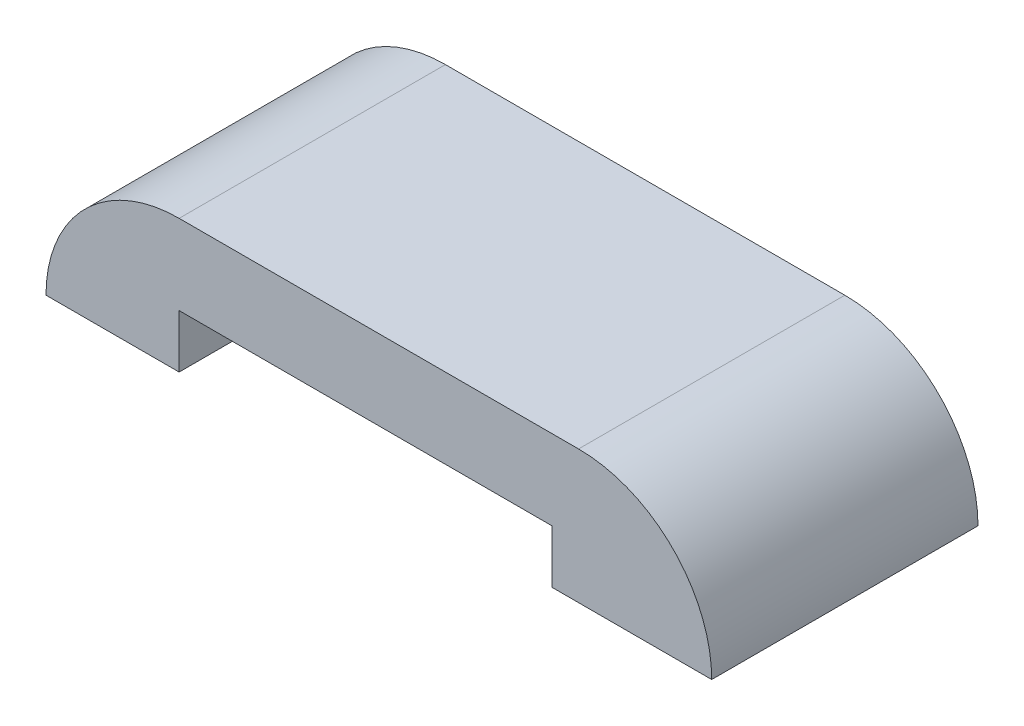
ISO-10303-21;
HEADER;
FILE_DESCRIPTION(('STEP AP214'),'2;1');
FILE_NAME('part.step','',(''),(''),'','','');
FILE_SCHEMA(('AUTOMOTIVE_DESIGN { 1 0 10303 214 1 1 1 1 }'));
ENDSEC;
DATA;
#1=APPLICATION_CONTEXT('core data for automotive mechanical design processes');
#2=APPLICATION_PROTOCOL_DEFINITION('international standard','automotive_design',2000,#1);
#3=PRODUCT_CONTEXT('',#1,'mechanical');
#4=PRODUCT('Part','Part','',(#3));
#5=PRODUCT_RELATED_PRODUCT_CATEGORY('part','',(#4));
#6=PRODUCT_DEFINITION_FORMATION('','',#4);
#7=PRODUCT_DEFINITION_CONTEXT('part definition',#1,'design');
#8=PRODUCT_DEFINITION('design','',#6,#7);
#9=PRODUCT_DEFINITION_SHAPE('','',#8);
#10=(LENGTH_UNIT() NAMED_UNIT(*) SI_UNIT(.MILLI.,.METRE.));
#11=(NAMED_UNIT(*) PLANE_ANGLE_UNIT() SI_UNIT($,.RADIAN.));
#12=(NAMED_UNIT(*) SI_UNIT($,.STERADIAN.) SOLID_ANGLE_UNIT());
#13=UNCERTAINTY_MEASURE_WITH_UNIT(LENGTH_MEASURE(1.E-05),#10,'distance_accuracy_value','');
#14=(GEOMETRIC_REPRESENTATION_CONTEXT(3) GLOBAL_UNCERTAINTY_ASSIGNED_CONTEXT((#13)) GLOBAL_UNIT_ASSIGNED_CONTEXT((#10,
#11,#12)) REPRESENTATION_CONTEXT('',''));
#15=CARTESIAN_POINT('',(0.,0.,0.));
#16=DIRECTION('',(0.,0.,1.));
#17=DIRECTION('',(1.,0.,0.));
#18=AXIS2_PLACEMENT_3D('',#15,#16,#17);
#19=CARTESIAN_POINT('',(20.,0.,10.));
#20=DIRECTION('',(0.,0.,1.));
#21=DIRECTION('',(1.,0.,0.));
#22=AXIS2_PLACEMENT_3D('',#19,#20,#21);
#23=CYLINDRICAL_SURFACE('',#22,5.);
#24=DIRECTION('',(0.,0.,-1.));
#25=VECTOR('',#24,1.);
#26=CARTESIAN_POINT('',(25.,0.,10.));
#27=LINE('',#26,#25);
#28=CARTESIAN_POINT('',(25.,0.,10.));
#29=VERTEX_POINT('',#28);
#30=CARTESIAN_POINT('',(25.,0.,0.));
#31=VERTEX_POINT('',#30);
#32=EDGE_CURVE('E142',#29,#31,#27,.T.);
#33=ORIENTED_EDGE('',*,*,#32,.T.);
#34=CARTESIAN_POINT('',(20.,0.,0.));
#35=DIRECTION('',(0.,0.,-1.));
#36=DIRECTION('',(-1.,0.,0.));
#37=AXIS2_PLACEMENT_3D('',#34,#35,#36);
#38=CIRCLE('',#37,5.);
#39=CARTESIAN_POINT('',(20.,5.,0.));
#40=VERTEX_POINT('',#39);
#41=EDGE_CURVE('E39',#40,#31,#38,.T.);
#42=ORIENTED_EDGE('',*,*,#41,.F.);
#43=DIRECTION('',(0.,0.,1.));
#44=VECTOR('',#43,1.);
#45=CARTESIAN_POINT('',(20.,5.,10.));
#46=LINE('',#45,#44);
#47=CARTESIAN_POINT('',(20.,5.,10.));
#48=VERTEX_POINT('',#47);
#49=EDGE_CURVE('E129',#48,#40,#46,.F.);
#50=ORIENTED_EDGE('',*,*,#49,.F.);
#51=CARTESIAN_POINT('',(20.,0.,10.));
#52=DIRECTION('',(0.,0.,-1.));
#53=DIRECTION('',(-1.,0.,0.));
#54=AXIS2_PLACEMENT_3D('',#51,#52,#53);
#55=CIRCLE('',#54,5.);
#56=EDGE_CURVE('E11',#29,#48,#55,.F.);
#57=ORIENTED_EDGE('',*,*,#56,.F.);
#58=EDGE_LOOP('',(#33,#42,#50,#57));
#59=FACE_BOUND('',#58,.T.);
#60=ADVANCED_FACE('F32',(#59),#23,.T.);
#61=CARTESIAN_POINT('',(5.,0.,10.));
#62=DIRECTION('',(0.,0.,-1.));
#63=DIRECTION('',(-1.,0.,0.));
#64=AXIS2_PLACEMENT_3D('',#61,#62,#63);
#65=CYLINDRICAL_SURFACE('',#64,5.);
#66=DIRECTION('',(0.,0.,-1.));
#67=VECTOR('',#66,1.);
#68=CARTESIAN_POINT('',(0.,0.,10.));
#69=LINE('',#68,#67);
#70=CARTESIAN_POINT('',(0.,0.,10.));
#71=VERTEX_POINT('',#70);
#72=CARTESIAN_POINT('',(0.,0.,0.));
#73=VERTEX_POINT('',#72);
#74=EDGE_CURVE('E147',#71,#73,#69,.T.);
#75=ORIENTED_EDGE('',*,*,#74,.F.);
#76=CARTESIAN_POINT('',(5.,0.,10.));
#77=DIRECTION('',(0.,0.,-1.));
#78=DIRECTION('',(-1.,0.,0.));
#79=AXIS2_PLACEMENT_3D('',#76,#77,#78);
#80=CIRCLE('',#79,5.);
#81=CARTESIAN_POINT('',(5.,5.,10.));
#82=VERTEX_POINT('',#81);
#83=EDGE_CURVE('E108',#82,#71,#80,.F.);
#84=ORIENTED_EDGE('',*,*,#83,.F.);
#85=DIRECTION('',(0.,0.,-1.));
#86=VECTOR('',#85,1.);
#87=CARTESIAN_POINT('',(5.,5.,10.));
#88=LINE('',#87,#86);
#89=CARTESIAN_POINT('',(5.,5.,0.));
#90=VERTEX_POINT('',#89);
#91=EDGE_CURVE('E117',#90,#82,#88,.F.);
#92=ORIENTED_EDGE('',*,*,#91,.F.);
#93=CARTESIAN_POINT('',(5.,0.,0.));
#94=DIRECTION('',(0.,0.,-1.));
#95=DIRECTION('',(-1.,0.,0.));
#96=AXIS2_PLACEMENT_3D('',#93,#94,#95);
#97=CIRCLE('',#96,5.);
#98=EDGE_CURVE('E126',#73,#90,#97,.T.);
#99=ORIENTED_EDGE('',*,*,#98,.F.);
#100=EDGE_LOOP('',(#75,#84,#92,#99));
#101=FACE_BOUND('',#100,.T.);
#102=ADVANCED_FACE('F171',(#101),#65,.T.);
#103=CARTESIAN_POINT('',(5.,0.,10.));
#104=DIRECTION('',(0.,1.,0.));
#105=DIRECTION('',(-1.,0.,0.));
#106=AXIS2_PLACEMENT_3D('',#103,#104,#105);
#107=PLANE('',#106);
#108=DIRECTION('',(1.,0.,0.));
#109=VECTOR('',#108,1.);
#110=CARTESIAN_POINT('',(5.,0.,0.));
#111=LINE('',#110,#109);
#112=CARTESIAN_POINT('',(5.,0.,0.));
#113=VERTEX_POINT('',#112);
#114=EDGE_CURVE('E116',#73,#113,#111,.T.);
#115=ORIENTED_EDGE('',*,*,#114,.T.);
#116=DIRECTION('',(0.,0.,-1.));
#117=VECTOR('',#116,1.);
#118=CARTESIAN_POINT('',(5.,0.,10.));
#119=LINE('',#118,#117);
#120=CARTESIAN_POINT('',(5.,0.,10.));
#121=VERTEX_POINT('',#120);
#122=EDGE_CURVE('E97',#121,#113,#119,.T.);
#123=ORIENTED_EDGE('',*,*,#122,.F.);
#124=DIRECTION('',(1.,0.,0.));
#125=VECTOR('',#124,1.);
#126=CARTESIAN_POINT('',(5.,0.,10.));
#127=LINE('',#126,#125);
#128=EDGE_CURVE('E103',#71,#121,#127,.T.);
#129=ORIENTED_EDGE('',*,*,#128,.F.);
#130=ORIENTED_EDGE('',*,*,#74,.T.);
#131=EDGE_LOOP('',(#115,#123,#129,#130));
#132=FACE_BOUND('',#131,.T.);
#133=ADVANCED_FACE('F114',(#132),#107,.F.);
#134=CARTESIAN_POINT('',(5.,2.,10.));
#135=DIRECTION('',(-1.,0.,0.));
#136=DIRECTION('',(0.,0.,1.));
#137=AXIS2_PLACEMENT_3D('',#134,#135,#136);
#138=PLANE('',#137);
#139=DIRECTION('',(0.,1.,0.));
#140=VECTOR('',#139,1.);
#141=CARTESIAN_POINT('',(5.,2.,0.));
#142=LINE('',#141,#140);
#143=CARTESIAN_POINT('',(5.,2.,0.));
#144=VERTEX_POINT('',#143);
#145=EDGE_CURVE('E163',#113,#144,#142,.T.);
#146=ORIENTED_EDGE('',*,*,#145,.T.);
#147=DIRECTION('',(0.,0.,-1.));
#148=VECTOR('',#147,1.);
#149=CARTESIAN_POINT('',(5.,2.,10.));
#150=LINE('',#149,#148);
#151=CARTESIAN_POINT('',(5.,2.,10.));
#152=VERTEX_POINT('',#151);
#153=EDGE_CURVE('E100',#152,#144,#150,.T.);
#154=ORIENTED_EDGE('',*,*,#153,.F.);
#155=DIRECTION('',(0.,1.,0.));
#156=VECTOR('',#155,1.);
#157=CARTESIAN_POINT('',(5.,2.,10.));
#158=LINE('',#157,#156);
#159=EDGE_CURVE('E93',#121,#152,#158,.T.);
#160=ORIENTED_EDGE('',*,*,#159,.F.);
#161=ORIENTED_EDGE('',*,*,#122,.T.);
#162=EDGE_LOOP('',(#146,#154,#160,#161));
#163=FACE_BOUND('',#162,.T.);
#164=ADVANCED_FACE('F95',(#163),#138,.F.);
#165=CARTESIAN_POINT('',(19.,2.,10.));
#166=DIRECTION('',(0.,1.,0.));
#167=DIRECTION('',(-1.,0.,0.));
#168=AXIS2_PLACEMENT_3D('',#165,#166,#167);
#169=PLANE('',#168);
#170=DIRECTION('',(1.,0.,0.));
#171=VECTOR('',#170,1.);
#172=CARTESIAN_POINT('',(19.,2.,0.));
#173=LINE('',#172,#171);
#174=CARTESIAN_POINT('',(19.,2.,0.));
#175=VERTEX_POINT('',#174);
#176=EDGE_CURVE('E161',#144,#175,#173,.T.);
#177=ORIENTED_EDGE('',*,*,#176,.T.);
#178=DIRECTION('',(0.,0.,-1.));
#179=VECTOR('',#178,1.);
#180=CARTESIAN_POINT('',(19.,2.,10.));
#181=LINE('',#180,#179);
#182=CARTESIAN_POINT('',(19.,2.,10.));
#183=VERTEX_POINT('',#182);
#184=EDGE_CURVE('E121',#183,#175,#181,.T.);
#185=ORIENTED_EDGE('',*,*,#184,.F.);
#186=DIRECTION('',(1.,0.,0.));
#187=VECTOR('',#186,1.);
#188=CARTESIAN_POINT('',(19.,2.,10.));
#189=LINE('',#188,#187);
#190=EDGE_CURVE('E102',#152,#183,#189,.T.);
#191=ORIENTED_EDGE('',*,*,#190,.F.);
#192=ORIENTED_EDGE('',*,*,#153,.T.);
#193=EDGE_LOOP('',(#177,#185,#191,#192));
#194=FACE_BOUND('',#193,.T.);
#195=ADVANCED_FACE('F181',(#194),#169,.F.);
#196=CARTESIAN_POINT('',(19.,0.,10.));
#197=DIRECTION('',(1.,0.,0.));
#198=DIRECTION('',(0.,0.,-1.));
#199=AXIS2_PLACEMENT_3D('',#196,#197,#198);
#200=PLANE('',#199);
#201=DIRECTION('',(0.,-1.,0.));
#202=VECTOR('',#201,1.);
#203=CARTESIAN_POINT('',(19.,0.,0.));
#204=LINE('',#203,#202);
#205=CARTESIAN_POINT('',(19.,0.,0.));
#206=VERTEX_POINT('',#205);
#207=EDGE_CURVE('E145',#175,#206,#204,.T.);
#208=ORIENTED_EDGE('',*,*,#207,.T.);
#209=DIRECTION('',(0.,0.,-1.));
#210=VECTOR('',#209,1.);
#211=CARTESIAN_POINT('',(19.,0.,10.));
#212=LINE('',#211,#210);
#213=CARTESIAN_POINT('',(19.,0.,10.));
#214=VERTEX_POINT('',#213);
#215=EDGE_CURVE('E144',#214,#206,#212,.T.);
#216=ORIENTED_EDGE('',*,*,#215,.F.);
#217=DIRECTION('',(0.,-1.,0.));
#218=VECTOR('',#217,1.);
#219=CARTESIAN_POINT('',(19.,0.,10.));
#220=LINE('',#219,#218);
#221=EDGE_CURVE('E158',#183,#214,#220,.T.);
#222=ORIENTED_EDGE('',*,*,#221,.F.);
#223=ORIENTED_EDGE('',*,*,#184,.T.);
#224=EDGE_LOOP('',(#208,#216,#222,#223));
#225=FACE_BOUND('',#224,.T.);
#226=ADVANCED_FACE('F157',(#225),#200,.F.);
#227=CARTESIAN_POINT('',(25.,0.,10.));
#228=DIRECTION('',(0.,1.,0.));
#229=DIRECTION('',(-1.,0.,0.));
#230=AXIS2_PLACEMENT_3D('',#227,#228,#229);
#231=PLANE('',#230);
#232=DIRECTION('',(1.,0.,0.));
#233=VECTOR('',#232,1.);
#234=CARTESIAN_POINT('',(25.,0.,0.));
#235=LINE('',#234,#233);
#236=EDGE_CURVE('E136',#206,#31,#235,.T.);
#237=ORIENTED_EDGE('',*,*,#236,.T.);
#238=ORIENTED_EDGE('',*,*,#32,.F.);
#239=DIRECTION('',(1.,0.,0.));
#240=VECTOR('',#239,1.);
#241=CARTESIAN_POINT('',(25.,0.,10.));
#242=LINE('',#241,#240);
#243=EDGE_CURVE('E252',#214,#29,#242,.T.);
#244=ORIENTED_EDGE('',*,*,#243,.F.);
#245=ORIENTED_EDGE('',*,*,#215,.T.);
#246=EDGE_LOOP('',(#237,#238,#244,#245));
#247=FACE_BOUND('',#246,.T.);
#248=ADVANCED_FACE('F140',(#247),#231,.F.);
#249=CARTESIAN_POINT('',(0.,5.,10.));
#250=DIRECTION('',(0.,-1.,0.));
#251=DIRECTION('',(0.,0.,-1.));
#252=AXIS2_PLACEMENT_3D('',#249,#250,#251);
#253=PLANE('',#252);
#254=DIRECTION('',(-1.,0.,0.));
#255=VECTOR('',#254,1.);
#256=CARTESIAN_POINT('',(0.,5.,10.));
#257=LINE('',#256,#255);
#258=EDGE_CURVE('E150',#48,#82,#257,.T.);
#259=ORIENTED_EDGE('',*,*,#258,.F.);
#260=ORIENTED_EDGE('',*,*,#49,.T.);
#261=DIRECTION('',(-1.,0.,0.));
#262=VECTOR('',#261,1.);
#263=CARTESIAN_POINT('',(0.,5.,0.));
#264=LINE('',#263,#262);
#265=EDGE_CURVE('E112',#40,#90,#264,.T.);
#266=ORIENTED_EDGE('',*,*,#265,.T.);
#267=ORIENTED_EDGE('',*,*,#91,.T.);
#268=EDGE_LOOP('',(#259,#260,#266,#267));
#269=FACE_BOUND('',#268,.T.);
#270=ADVANCED_FACE('F168',(#269),#253,.F.);
#271=CARTESIAN_POINT('',(0.,0.,10.));
#272=DIRECTION('',(0.,0.,-1.));
#273=DIRECTION('',(-1.,0.,0.));
#274=AXIS2_PLACEMENT_3D('',#271,#272,#273);
#275=PLANE('',#274);
#276=ORIENTED_EDGE('',*,*,#243,.T.);
#277=ORIENTED_EDGE('',*,*,#56,.T.);
#278=ORIENTED_EDGE('',*,*,#258,.T.);
#279=ORIENTED_EDGE('',*,*,#83,.T.);
#280=ORIENTED_EDGE('',*,*,#128,.T.);
#281=ORIENTED_EDGE('',*,*,#159,.T.);
#282=ORIENTED_EDGE('',*,*,#190,.T.);
#283=ORIENTED_EDGE('',*,*,#221,.T.);
#284=EDGE_LOOP('',(#276,#277,#278,#279,#280,#281,#282,#283));
#285=FACE_BOUND('',#284,.T.);
#286=ADVANCED_FACE('F106',(#285),#275,.F.);
#287=CARTESIAN_POINT('',(0.,0.,0.));
#288=DIRECTION('',(0.,0.,-1.));
#289=DIRECTION('',(-1.,0.,0.));
#290=AXIS2_PLACEMENT_3D('',#287,#288,#289);
#291=PLANE('',#290);
#292=ORIENTED_EDGE('',*,*,#265,.F.);
#293=ORIENTED_EDGE('',*,*,#41,.T.);
#294=ORIENTED_EDGE('',*,*,#236,.F.);
#295=ORIENTED_EDGE('',*,*,#207,.F.);
#296=ORIENTED_EDGE('',*,*,#176,.F.);
#297=ORIENTED_EDGE('',*,*,#145,.F.);
#298=ORIENTED_EDGE('',*,*,#114,.F.);
#299=ORIENTED_EDGE('',*,*,#98,.T.);
#300=EDGE_LOOP('',(#292,#293,#294,#295,#296,#297,#298,#299));
#301=FACE_BOUND('',#300,.T.);
#302=ADVANCED_FACE('F134',(#301),#291,.T.);
#303=CLOSED_SHELL('',(#60,#102,#133,#164,#195,#226,#248,#270,#286,#302));
#304=MANIFOLD_SOLID_BREP('B2',#303);
#305=ADVANCED_BREP_SHAPE_REPRESENTATION('',(#18,#304),#14);
#306=SHAPE_DEFINITION_REPRESENTATION(#9,#305);
ENDSEC;
END-ISO-10303-21;
